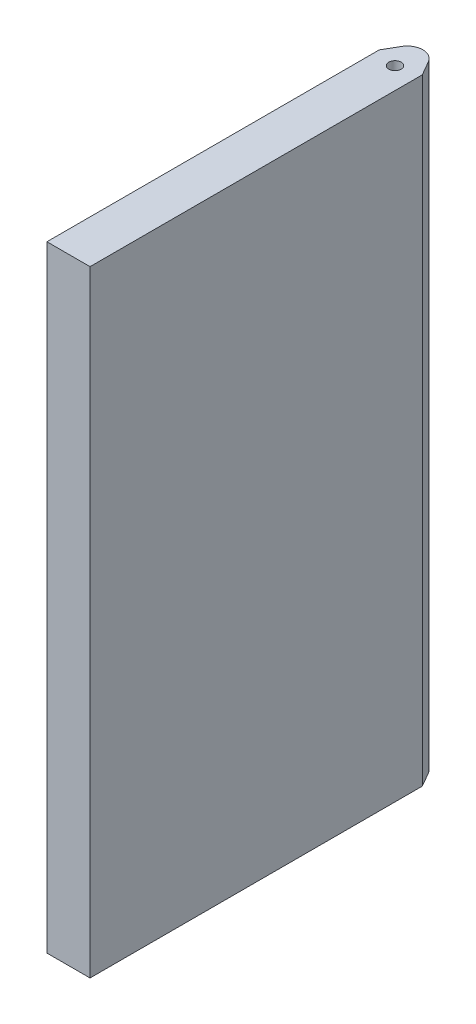
ISO-10303-21;
HEADER;
FILE_DESCRIPTION(('STEP AP214'),'2;1');
FILE_NAME('part.step','',(''),(''),'','','');
FILE_SCHEMA(('AUTOMOTIVE_DESIGN { 1 0 10303 214 1 1 1 1 }'));
ENDSEC;
DATA;
#1=APPLICATION_CONTEXT('core data for automotive mechanical design processes');
#2=APPLICATION_PROTOCOL_DEFINITION('international standard','automotive_design',2000,#1);
#3=PRODUCT_CONTEXT('',#1,'mechanical');
#4=PRODUCT('Part','Part','',(#3));
#5=PRODUCT_RELATED_PRODUCT_CATEGORY('part','',(#4));
#6=PRODUCT_DEFINITION_FORMATION('','',#4);
#7=PRODUCT_DEFINITION_CONTEXT('part definition',#1,'design');
#8=PRODUCT_DEFINITION('design','',#6,#7);
#9=PRODUCT_DEFINITION_SHAPE('','',#8);
#10=(LENGTH_UNIT() NAMED_UNIT(*) SI_UNIT(.MILLI.,.METRE.));
#11=(NAMED_UNIT(*) PLANE_ANGLE_UNIT() SI_UNIT($,.RADIAN.));
#12=(NAMED_UNIT(*) SI_UNIT($,.STERADIAN.) SOLID_ANGLE_UNIT());
#13=UNCERTAINTY_MEASURE_WITH_UNIT(LENGTH_MEASURE(1.E-05),#10,'distance_accuracy_value','');
#14=(GEOMETRIC_REPRESENTATION_CONTEXT(3) GLOBAL_UNCERTAINTY_ASSIGNED_CONTEXT((#13)) GLOBAL_UNIT_ASSIGNED_CONTEXT((#10,
#11,#12)) REPRESENTATION_CONTEXT('',''));
#15=CARTESIAN_POINT('',(0.,0.,0.));
#16=DIRECTION('',(0.,0.,1.));
#17=DIRECTION('',(1.,0.,0.));
#18=AXIS2_PLACEMENT_3D('',#15,#16,#17);
#19=CARTESIAN_POINT('',(0.,0.,-50.));
#20=DIRECTION('',(0.,-1.,0.));
#21=DIRECTION('',(0.,0.,-1.));
#22=AXIS2_PLACEMENT_3D('',#19,#20,#21);
#23=CYLINDRICAL_SURFACE('',#22,5.);
#24=DIRECTION('',(0.,-1.,0.));
#25=VECTOR('',#24,1.);
#26=CARTESIAN_POINT('',(-4.33012701892219,0.,-52.5));
#27=LINE('',#26,#25);
#28=CARTESIAN_POINT('',(-4.33012701892219,200.,-52.5));
#29=VERTEX_POINT('',#28);
#30=CARTESIAN_POINT('',(-4.3301270189222,0.,-52.5));
#31=VERTEX_POINT('',#30);
#32=EDGE_CURVE('E108',#29,#31,#27,.T.);
#33=ORIENTED_EDGE('',*,*,#32,.F.);
#34=CARTESIAN_POINT('',(0.,200.,-50.));
#35=DIRECTION('',(0.,-1.,0.));
#36=DIRECTION('',(0.,0.,-1.));
#37=AXIS2_PLACEMENT_3D('',#34,#35,#36);
#38=CIRCLE('',#37,5.);
#39=CARTESIAN_POINT('',(4.33012701892221,200.,-52.5));
#40=VERTEX_POINT('',#39);
#41=EDGE_CURVE('E41',#40,#29,#38,.F.);
#42=ORIENTED_EDGE('',*,*,#41,.F.);
#43=DIRECTION('',(0.,-1.,0.));
#44=VECTOR('',#43,1.);
#45=CARTESIAN_POINT('',(4.33012701892221,0.,-52.5));
#46=LINE('',#45,#44);
#47=CARTESIAN_POINT('',(4.33012701892221,0.,-52.5));
#48=VERTEX_POINT('',#47);
#49=EDGE_CURVE('E116',#48,#40,#46,.F.);
#50=ORIENTED_EDGE('',*,*,#49,.F.);
#51=CARTESIAN_POINT('',(0.,0.,-50.));
#52=DIRECTION('',(0.,-1.,0.));
#53=DIRECTION('',(0.,0.,-1.));
#54=AXIS2_PLACEMENT_3D('',#51,#52,#53);
#55=CIRCLE('',#54,5.);
#56=EDGE_CURVE('E12',#31,#48,#55,.T.);
#57=ORIENTED_EDGE('',*,*,#56,.F.);
#58=EDGE_LOOP('',(#33,#42,#50,#57));
#59=FACE_BOUND('',#58,.T.);
#60=ADVANCED_FACE('F34',(#59),#23,.T.);
#61=CARTESIAN_POINT('',(0.,200.,0.));
#62=DIRECTION('',(0.,-1.,0.));
#63=DIRECTION('',(0.,0.,-1.));
#64=AXIS2_PLACEMENT_3D('',#61,#62,#63);
#65=PLANE('',#64);
#66=CARTESIAN_POINT('',(0.,200.,-46.));
#67=DIRECTION('',(0.,-1.,0.));
#68=DIRECTION('',(0.,0.,-1.));
#69=AXIS2_PLACEMENT_3D('',#66,#67,#68);
#70=CIRCLE('',#69,2.);
#71=CARTESIAN_POINT('',(0.,200.,-48.));
#72=VERTEX_POINT('',#71);
#73=EDGE_CURVE('E142',#72,#72,#70,.T.);
#74=ORIENTED_EDGE('',*,*,#73,.T.);
#75=EDGE_LOOP('',(#74));
#76=FACE_BOUND('',#75,.T.);
#77=DIRECTION('',(1.,0.,0.));
#78=VECTOR('',#77,1.);
#79=CARTESIAN_POINT('',(-15.,200.,60.));
#80=LINE('',#79,#78);
#81=CARTESIAN_POINT('',(-6.99999999999999,200.,60.));
#82=VERTEX_POINT('',#81);
#83=CARTESIAN_POINT('',(7.,200.,60.));
#84=VERTEX_POINT('',#83);
#85=EDGE_CURVE('E105',#82,#84,#80,.T.);
#86=ORIENTED_EDGE('',*,*,#85,.T.);
#87=DIRECTION('',(0.,0.,1.));
#88=VECTOR('',#87,1.);
#89=CARTESIAN_POINT('',(6.99999999999999,200.,-47.8756443470177));
#90=LINE('',#89,#88);
#91=CARTESIAN_POINT('',(6.99999999999999,200.,-47.8756443470177));
#92=VERTEX_POINT('',#91);
#93=EDGE_CURVE('E87',#92,#84,#90,.T.);
#94=ORIENTED_EDGE('',*,*,#93,.F.);
#95=DIRECTION('',(-0.499999999999998,0.,-0.86602540378444));
#96=VECTOR('',#95,1.);
#97=CARTESIAN_POINT('',(15.,200.,-34.0192378864667));
#98=LINE('',#97,#96);
#99=EDGE_CURVE('E126',#92,#40,#98,.T.);
#100=ORIENTED_EDGE('',*,*,#99,.T.);
#101=ORIENTED_EDGE('',*,*,#41,.T.);
#102=DIRECTION('',(-0.499999999999998,0.,0.86602540378444));
#103=VECTOR('',#102,1.);
#104=CARTESIAN_POINT('',(0.,200.,-60.));
#105=LINE('',#104,#103);
#106=CARTESIAN_POINT('',(-6.99999999999998,200.,-47.8756443470178));
#107=VERTEX_POINT('',#106);
#108=EDGE_CURVE('E124',#29,#107,#105,.T.);
#109=ORIENTED_EDGE('',*,*,#108,.T.);
#110=DIRECTION('',(0.,0.,-1.));
#111=VECTOR('',#110,1.);
#112=CARTESIAN_POINT('',(-6.99999999999999,200.,60.));
#113=LINE('',#112,#111);
#114=EDGE_CURVE('E56',#82,#107,#113,.T.);
#115=ORIENTED_EDGE('',*,*,#114,.F.);
#116=EDGE_LOOP('',(#86,#94,#100,#101,#109,#115));
#117=FACE_BOUND('',#116,.T.);
#118=ADVANCED_FACE('F122',(#76,#117),#65,.F.);
#119=CARTESIAN_POINT('',(0.,0.,0.));
#120=DIRECTION('',(0.,-1.,0.));
#121=DIRECTION('',(0.,0.,-1.));
#122=AXIS2_PLACEMENT_3D('',#119,#120,#121);
#123=PLANE('',#122);
#124=CARTESIAN_POINT('',(0.,0.,-46.));
#125=DIRECTION('',(0.,-1.,0.));
#126=DIRECTION('',(0.,0.,-1.));
#127=AXIS2_PLACEMENT_3D('',#124,#125,#126);
#128=CIRCLE('',#127,2.);
#129=CARTESIAN_POINT('',(0.,0.,-48.));
#130=VERTEX_POINT('',#129);
#131=EDGE_CURVE('E144',#130,#130,#128,.T.);
#132=ORIENTED_EDGE('',*,*,#131,.F.);
#133=EDGE_LOOP('',(#132));
#134=FACE_BOUND('',#133,.T.);
#135=DIRECTION('',(0.,0.,1.));
#136=VECTOR('',#135,1.);
#137=CARTESIAN_POINT('',(6.99999999999999,0.,-47.8756443470177));
#138=LINE('',#137,#136);
#139=CARTESIAN_POINT('',(7.00000000000003,0.,-47.8756443470177));
#140=VERTEX_POINT('',#139);
#141=CARTESIAN_POINT('',(7.,0.,60.));
#142=VERTEX_POINT('',#141);
#143=EDGE_CURVE('E48',#140,#142,#138,.T.);
#144=ORIENTED_EDGE('',*,*,#143,.T.);
#145=DIRECTION('',(1.,0.,0.));
#146=VECTOR('',#145,1.);
#147=CARTESIAN_POINT('',(-15.,0.,60.));
#148=LINE('',#147,#146);
#149=CARTESIAN_POINT('',(-6.99999999999999,0.,60.));
#150=VERTEX_POINT('',#149);
#151=EDGE_CURVE('E99',#150,#142,#148,.T.);
#152=ORIENTED_EDGE('',*,*,#151,.F.);
#153=DIRECTION('',(0.,0.,-1.));
#154=VECTOR('',#153,1.);
#155=CARTESIAN_POINT('',(-6.99999999999999,0.,60.));
#156=LINE('',#155,#154);
#157=CARTESIAN_POINT('',(-6.99999999999999,0.,-47.8756443470178));
#158=VERTEX_POINT('',#157);
#159=EDGE_CURVE('E137',#150,#158,#156,.T.);
#160=ORIENTED_EDGE('',*,*,#159,.T.);
#161=DIRECTION('',(-0.499999999999998,0.,0.86602540378444));
#162=VECTOR('',#161,1.);
#163=CARTESIAN_POINT('',(0.,0.,-60.));
#164=LINE('',#163,#162);
#165=EDGE_CURVE('E106',#31,#158,#164,.T.);
#166=ORIENTED_EDGE('',*,*,#165,.F.);
#167=ORIENTED_EDGE('',*,*,#56,.T.);
#168=DIRECTION('',(-0.499999999999998,0.,-0.86602540378444));
#169=VECTOR('',#168,1.);
#170=CARTESIAN_POINT('',(15.,0.,-34.0192378864667));
#171=LINE('',#170,#169);
#172=EDGE_CURVE('E100',#140,#48,#171,.T.);
#173=ORIENTED_EDGE('',*,*,#172,.F.);
#174=EDGE_LOOP('',(#144,#152,#160,#166,#167,#173));
#175=FACE_BOUND('',#174,.T.);
#176=ADVANCED_FACE('F97',(#134,#175),#123,.T.);
#177=CARTESIAN_POINT('',(-15.,200.,60.));
#178=DIRECTION('',(0.,0.,-1.));
#179=DIRECTION('',(-1.,0.,0.));
#180=AXIS2_PLACEMENT_3D('',#177,#178,#179);
#181=PLANE('',#180);
#182=ORIENTED_EDGE('',*,*,#151,.T.);
#183=DIRECTION('',(0.,1.,0.));
#184=VECTOR('',#183,1.);
#185=CARTESIAN_POINT('',(7.,0.,60.));
#186=LINE('',#185,#184);
#187=EDGE_CURVE('E84',#142,#84,#186,.T.);
#188=ORIENTED_EDGE('',*,*,#187,.T.);
#189=ORIENTED_EDGE('',*,*,#85,.F.);
#190=DIRECTION('',(0.,1.,0.));
#191=VECTOR('',#190,1.);
#192=CARTESIAN_POINT('',(-6.99999999999999,0.,60.));
#193=LINE('',#192,#191);
#194=EDGE_CURVE('E104',#150,#82,#193,.T.);
#195=ORIENTED_EDGE('',*,*,#194,.F.);
#196=EDGE_LOOP('',(#182,#188,#189,#195));
#197=FACE_BOUND('',#196,.T.);
#198=ADVANCED_FACE('F103',(#197),#181,.F.);
#199=CARTESIAN_POINT('',(15.,0.,-34.0192378864667));
#200=DIRECTION('',(0.86602540378444,0.,-0.499999999999998));
#201=DIRECTION('',(-0.499999999999998,0.,-0.86602540378444));
#202=AXIS2_PLACEMENT_3D('',#199,#200,#201);
#203=PLANE('',#202);
#204=DIRECTION('',(0.,1.,0.));
#205=VECTOR('',#204,1.);
#206=CARTESIAN_POINT('',(6.99999999999999,0.,-47.8756443470177));
#207=LINE('',#206,#205);
#208=EDGE_CURVE('E92',#140,#92,#207,.T.);
#209=ORIENTED_EDGE('',*,*,#208,.F.);
#210=ORIENTED_EDGE('',*,*,#172,.T.);
#211=ORIENTED_EDGE('',*,*,#49,.T.);
#212=ORIENTED_EDGE('',*,*,#99,.F.);
#213=EDGE_LOOP('',(#209,#210,#211,#212));
#214=FACE_BOUND('',#213,.T.);
#215=ADVANCED_FACE('F164',(#214),#203,.T.);
#216=CARTESIAN_POINT('',(0.,0.,-60.));
#217=DIRECTION('',(-0.86602540378444,0.,-0.499999999999998));
#218=DIRECTION('',(-0.499999999999998,0.,0.86602540378444));
#219=AXIS2_PLACEMENT_3D('',#216,#217,#218);
#220=PLANE('',#219);
#221=DIRECTION('',(0.,1.,0.));
#222=VECTOR('',#221,1.);
#223=CARTESIAN_POINT('',(-6.99999999999999,0.,-47.8756443470178));
#224=LINE('',#223,#222);
#225=EDGE_CURVE('E132',#158,#107,#224,.T.);
#226=ORIENTED_EDGE('',*,*,#225,.T.);
#227=ORIENTED_EDGE('',*,*,#108,.F.);
#228=ORIENTED_EDGE('',*,*,#32,.T.);
#229=ORIENTED_EDGE('',*,*,#165,.T.);
#230=EDGE_LOOP('',(#226,#227,#228,#229));
#231=FACE_BOUND('',#230,.T.);
#232=ADVANCED_FACE('F131',(#231),#220,.T.);
#233=CARTESIAN_POINT('',(-6.99999999999999,0.,60.));
#234=DIRECTION('',(1.,0.,0.));
#235=DIRECTION('',(0.,0.,-1.));
#236=AXIS2_PLACEMENT_3D('',#233,#234,#235);
#237=PLANE('',#236);
#238=ORIENTED_EDGE('',*,*,#114,.T.);
#239=ORIENTED_EDGE('',*,*,#225,.F.);
#240=ORIENTED_EDGE('',*,*,#159,.F.);
#241=ORIENTED_EDGE('',*,*,#194,.T.);
#242=EDGE_LOOP('',(#238,#239,#240,#241));
#243=FACE_BOUND('',#242,.T.);
#244=ADVANCED_FACE('F197',(#243),#237,.F.);
#245=CARTESIAN_POINT('',(6.99999999999999,0.,-47.8756443470177));
#246=DIRECTION('',(-1.,0.,0.));
#247=DIRECTION('',(0.,0.,1.));
#248=AXIS2_PLACEMENT_3D('',#245,#246,#247);
#249=PLANE('',#248);
#250=ORIENTED_EDGE('',*,*,#93,.T.);
#251=ORIENTED_EDGE('',*,*,#187,.F.);
#252=ORIENTED_EDGE('',*,*,#143,.F.);
#253=ORIENTED_EDGE('',*,*,#208,.T.);
#254=EDGE_LOOP('',(#250,#251,#252,#253));
#255=FACE_BOUND('',#254,.T.);
#256=ADVANCED_FACE('F85',(#255),#249,.F.);
#257=CARTESIAN_POINT('',(0.,200.,-46.));
#258=DIRECTION('',(0.,-1.,0.));
#259=DIRECTION('',(0.,0.,-1.));
#260=AXIS2_PLACEMENT_3D('',#257,#258,#259);
#261=CYLINDRICAL_SURFACE('',#260,2.);
#262=ORIENTED_EDGE('',*,*,#73,.F.);
#263=EDGE_LOOP('',(#262));
#264=FACE_BOUND('',#263,.T.);
#265=ORIENTED_EDGE('',*,*,#131,.T.);
#266=EDGE_LOOP('',(#265));
#267=FACE_BOUND('',#266,.T.);
#268=ADVANCED_FACE('F151',(#264,#267),#261,.F.);
#269=CLOSED_SHELL('',(#60,#118,#176,#198,#215,#232,#244,#256,#268));
#270=MANIFOLD_SOLID_BREP('B2',#269);
#271=ADVANCED_BREP_SHAPE_REPRESENTATION('',(#18,#270),#14);
#272=SHAPE_DEFINITION_REPRESENTATION(#9,#271);
ENDSEC;
END-ISO-10303-21;
